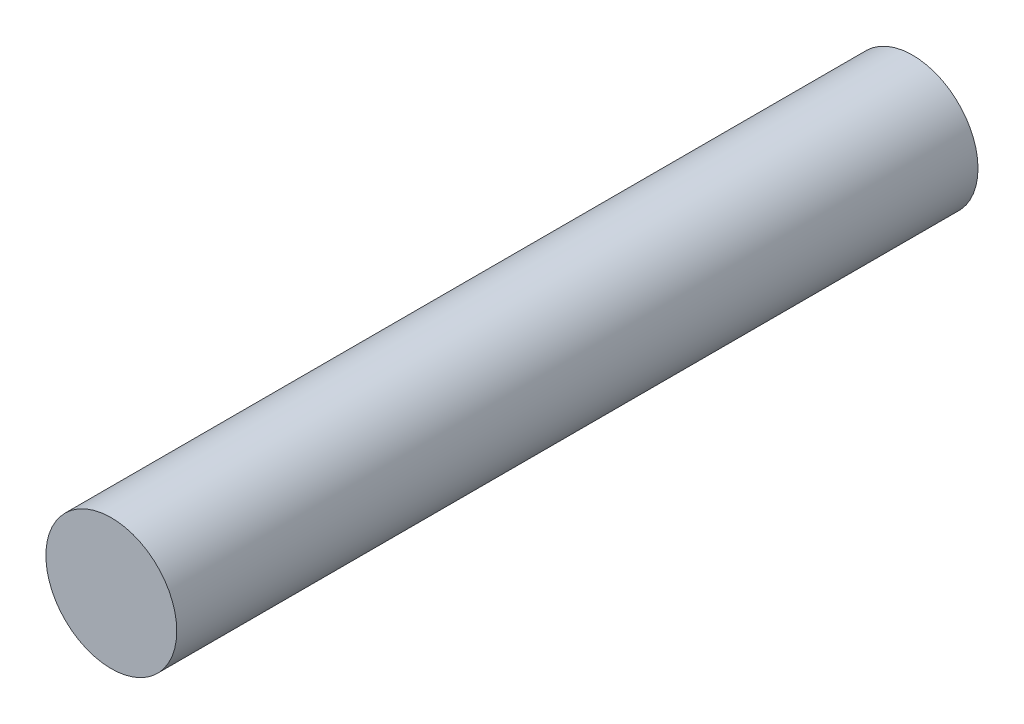
ISO-10303-21;
HEADER;
FILE_DESCRIPTION(('STEP AP214'),'2;1');
FILE_NAME('part.step','',(''),(''),'','','');
FILE_SCHEMA(('AUTOMOTIVE_DESIGN { 1 0 10303 214 1 1 1 1 }'));
ENDSEC;
DATA;
#1=APPLICATION_CONTEXT('core data for automotive mechanical design processes');
#2=APPLICATION_PROTOCOL_DEFINITION('international standard','automotive_design',2000,#1);
#3=PRODUCT_CONTEXT('',#1,'mechanical');
#4=PRODUCT('Part','Part','',(#3));
#5=PRODUCT_RELATED_PRODUCT_CATEGORY('part','',(#4));
#6=PRODUCT_DEFINITION_FORMATION('','',#4);
#7=PRODUCT_DEFINITION_CONTEXT('part definition',#1,'design');
#8=PRODUCT_DEFINITION('design','',#6,#7);
#9=PRODUCT_DEFINITION_SHAPE('','',#8);
#10=(LENGTH_UNIT() NAMED_UNIT(*) SI_UNIT(.MILLI.,.METRE.));
#11=(NAMED_UNIT(*) PLANE_ANGLE_UNIT() SI_UNIT($,.RADIAN.));
#12=(NAMED_UNIT(*) SI_UNIT($,.STERADIAN.) SOLID_ANGLE_UNIT());
#13=UNCERTAINTY_MEASURE_WITH_UNIT(LENGTH_MEASURE(1.E-05),#10,'distance_accuracy_value','');
#14=(GEOMETRIC_REPRESENTATION_CONTEXT(3) GLOBAL_UNCERTAINTY_ASSIGNED_CONTEXT((#13)) GLOBAL_UNIT_ASSIGNED_CONTEXT((#10,
#11,#12)) REPRESENTATION_CONTEXT('',''));
#15=CARTESIAN_POINT('',(0.,0.,0.));
#16=DIRECTION('',(0.,0.,1.));
#17=DIRECTION('',(1.,0.,0.));
#18=AXIS2_PLACEMENT_3D('',#15,#16,#17);
#19=CARTESIAN_POINT('',(0.,0.,30.));
#20=DIRECTION('',(0.,0.,-1.));
#21=DIRECTION('',(-1.,0.,0.));
#22=AXIS2_PLACEMENT_3D('',#19,#20,#21);
#23=CYLINDRICAL_SURFACE('',#22,2.45);
#24=CARTESIAN_POINT('',(0.,0.,30.));
#25=DIRECTION('',(0.,0.,1.));
#26=DIRECTION('',(1.,0.,0.));
#27=AXIS2_PLACEMENT_3D('',#24,#25,#26);
#28=CIRCLE('',#27,2.45);
#29=CARTESIAN_POINT('',(2.45,0.,30.));
#30=VERTEX_POINT('',#29);
#31=EDGE_CURVE('E10',#30,#30,#28,.T.);
#32=ORIENTED_EDGE('',*,*,#31,.F.);
#33=EDGE_LOOP('',(#32));
#34=FACE_BOUND('',#33,.T.);
#35=CARTESIAN_POINT('',(0.,0.,0.));
#36=DIRECTION('',(0.,0.,1.));
#37=DIRECTION('',(1.,0.,0.));
#38=AXIS2_PLACEMENT_3D('',#35,#36,#37);
#39=CIRCLE('',#38,2.45);
#40=CARTESIAN_POINT('',(2.45,0.,0.));
#41=VERTEX_POINT('',#40);
#42=EDGE_CURVE('E44',#41,#41,#39,.T.);
#43=ORIENTED_EDGE('',*,*,#42,.T.);
#44=EDGE_LOOP('',(#43));
#45=FACE_BOUND('',#44,.T.);
#46=ADVANCED_FACE('F41',(#34,#45),#23,.T.);
#47=CARTESIAN_POINT('',(0.,0.,30.));
#48=DIRECTION('',(0.,0.,1.));
#49=DIRECTION('',(1.,0.,0.));
#50=AXIS2_PLACEMENT_3D('',#47,#48,#49);
#51=PLANE('',#50);
#52=ORIENTED_EDGE('',*,*,#31,.T.);
#53=EDGE_LOOP('',(#52));
#54=FACE_BOUND('',#53,.T.);
#55=ADVANCED_FACE('F58',(#54),#51,.T.);
#56=CARTESIAN_POINT('',(0.,0.,0.));
#57=DIRECTION('',(0.,0.,1.));
#58=DIRECTION('',(1.,0.,0.));
#59=AXIS2_PLACEMENT_3D('',#56,#57,#58);
#60=PLANE('',#59);
#61=ORIENTED_EDGE('',*,*,#42,.F.);
#62=EDGE_LOOP('',(#61));
#63=FACE_BOUND('',#62,.T.);
#64=ADVANCED_FACE('F56',(#63),#60,.F.);
#65=CLOSED_SHELL('',(#46,#55,#64));
#66=MANIFOLD_SOLID_BREP('B2',#65);
#67=ADVANCED_BREP_SHAPE_REPRESENTATION('',(#18,#66),#14);
#68=SHAPE_DEFINITION_REPRESENTATION(#9,#67);
ENDSEC;
END-ISO-10303-21;
